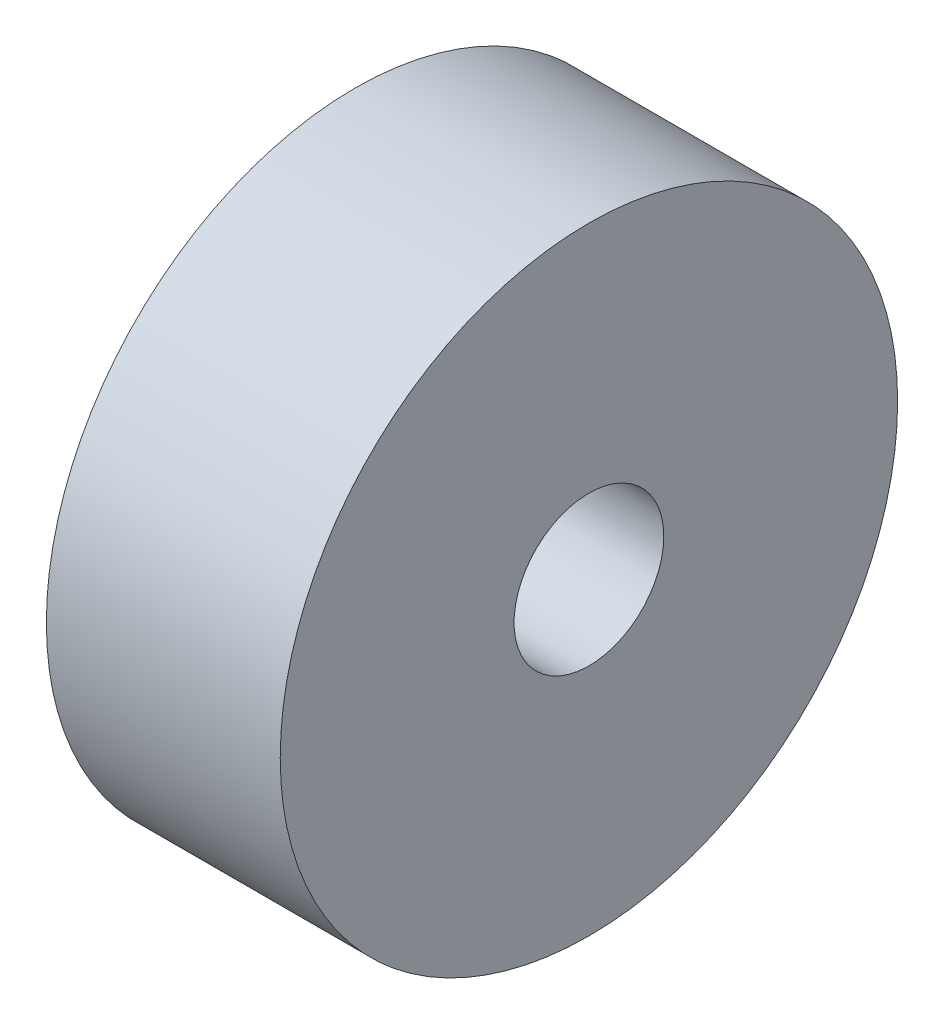
ISO-10303-21;
HEADER;
FILE_DESCRIPTION(('STEP AP214'),'2;1');
FILE_NAME('part.step','',(''),(''),'','','');
FILE_SCHEMA(('AUTOMOTIVE_DESIGN { 1 0 10303 214 1 1 1 1 }'));
ENDSEC;
DATA;
#1=APPLICATION_CONTEXT('core data for automotive mechanical design processes');
#2=APPLICATION_PROTOCOL_DEFINITION('international standard','automotive_design',2000,#1);
#3=PRODUCT_CONTEXT('',#1,'mechanical');
#4=PRODUCT('Part','Part','',(#3));
#5=PRODUCT_RELATED_PRODUCT_CATEGORY('part','',(#4));
#6=PRODUCT_DEFINITION_FORMATION('','',#4);
#7=PRODUCT_DEFINITION_CONTEXT('part definition',#1,'design');
#8=PRODUCT_DEFINITION('design','',#6,#7);
#9=PRODUCT_DEFINITION_SHAPE('','',#8);
#10=(LENGTH_UNIT() NAMED_UNIT(*) SI_UNIT(.MILLI.,.METRE.));
#11=(NAMED_UNIT(*) PLANE_ANGLE_UNIT() SI_UNIT($,.RADIAN.));
#12=(NAMED_UNIT(*) SI_UNIT($,.STERADIAN.) SOLID_ANGLE_UNIT());
#13=UNCERTAINTY_MEASURE_WITH_UNIT(LENGTH_MEASURE(1.E-05),#10,'distance_accuracy_value','');
#14=(GEOMETRIC_REPRESENTATION_CONTEXT(3) GLOBAL_UNCERTAINTY_ASSIGNED_CONTEXT((#13)) GLOBAL_UNIT_ASSIGNED_CONTEXT((#10,
#11,#12)) REPRESENTATION_CONTEXT('',''));
#15=CARTESIAN_POINT('',(0.,0.,0.));
#16=DIRECTION('',(0.,0.,1.));
#17=DIRECTION('',(1.,0.,0.));
#18=AXIS2_PLACEMENT_3D('',#15,#16,#17);
#19=CARTESIAN_POINT('',(25.,0.,0.));
#20=DIRECTION('',(-1.,0.,0.));
#21=DIRECTION('',(0.,0.,1.));
#22=AXIS2_PLACEMENT_3D('',#19,#20,#21);
#23=CYLINDRICAL_SURFACE('',#22,33.);
#24=CARTESIAN_POINT('',(25.,0.,0.));
#25=DIRECTION('',(1.,0.,0.));
#26=DIRECTION('',(0.,0.,-1.));
#27=AXIS2_PLACEMENT_3D('',#24,#25,#26);
#28=CIRCLE('',#27,33.);
#29=CARTESIAN_POINT('',(25.,0.,-33.));
#30=VERTEX_POINT('',#29);
#31=EDGE_CURVE('E10',#30,#30,#28,.T.);
#32=ORIENTED_EDGE('',*,*,#31,.F.);
#33=EDGE_LOOP('',(#32));
#34=FACE_BOUND('',#33,.T.);
#35=CARTESIAN_POINT('',(0.,0.,0.));
#36=DIRECTION('',(1.,0.,0.));
#37=DIRECTION('',(0.,0.,-1.));
#38=AXIS2_PLACEMENT_3D('',#35,#36,#37);
#39=CIRCLE('',#38,33.);
#40=CARTESIAN_POINT('',(0.,0.,-33.));
#41=VERTEX_POINT('',#40);
#42=EDGE_CURVE('E41',#41,#41,#39,.T.);
#43=ORIENTED_EDGE('',*,*,#42,.T.);
#44=EDGE_LOOP('',(#43));
#45=FACE_BOUND('',#44,.T.);
#46=ADVANCED_FACE('F34',(#34,#45),#23,.T.);
#47=CARTESIAN_POINT('',(25.,0.,0.));
#48=DIRECTION('',(1.,0.,0.));
#49=DIRECTION('',(0.,0.,-1.));
#50=AXIS2_PLACEMENT_3D('',#47,#48,#49);
#51=PLANE('',#50);
#52=CARTESIAN_POINT('',(25.,0.,0.));
#53=DIRECTION('',(1.,0.,0.));
#54=DIRECTION('',(0.,0.,-1.));
#55=AXIS2_PLACEMENT_3D('',#52,#53,#54);
#56=CIRCLE('',#55,8.);
#57=CARTESIAN_POINT('',(25.,0.,-8.));
#58=VERTEX_POINT('',#57);
#59=EDGE_CURVE('E47',#58,#58,#56,.T.);
#60=ORIENTED_EDGE('',*,*,#59,.F.);
#61=EDGE_LOOP('',(#60));
#62=FACE_BOUND('',#61,.T.);
#63=ORIENTED_EDGE('',*,*,#31,.T.);
#64=EDGE_LOOP('',(#63));
#65=FACE_BOUND('',#64,.T.);
#66=ADVANCED_FACE('F63',(#62,#65),#51,.T.);
#67=CARTESIAN_POINT('',(0.,0.,0.));
#68=DIRECTION('',(1.,0.,0.));
#69=DIRECTION('',(0.,0.,-1.));
#70=AXIS2_PLACEMENT_3D('',#67,#68,#69);
#71=PLANE('',#70);
#72=CARTESIAN_POINT('',(0.,0.,0.));
#73=DIRECTION('',(1.,0.,0.));
#74=DIRECTION('',(0.,0.,-1.));
#75=AXIS2_PLACEMENT_3D('',#72,#73,#74);
#76=CIRCLE('',#75,8.);
#77=CARTESIAN_POINT('',(0.,0.,-8.));
#78=VERTEX_POINT('',#77);
#79=EDGE_CURVE('E37',#78,#78,#76,.T.);
#80=ORIENTED_EDGE('',*,*,#79,.T.);
#81=EDGE_LOOP('',(#80));
#82=FACE_BOUND('',#81,.T.);
#83=ORIENTED_EDGE('',*,*,#42,.F.);
#84=EDGE_LOOP('',(#83));
#85=FACE_BOUND('',#84,.T.);
#86=ADVANCED_FACE('F54',(#82,#85),#71,.F.);
#87=CARTESIAN_POINT('',(-1.2E-05,0.,0.));
#88=DIRECTION('',(1.,0.,0.));
#89=DIRECTION('',(0.,0.,-1.));
#90=AXIS2_PLACEMENT_3D('',#87,#88,#89);
#91=CYLINDRICAL_SURFACE('',#90,8.);
#92=CARTESIAN_POINT('',(25.,0.,-8.));
#93=CARTESIAN_POINT('',(24.7395833333333,0.,-8.));
#94=CARTESIAN_POINT('',(24.4791666666667,0.,-8.));
#95=CARTESIAN_POINT('',(23.9583333333333,0.,-8.));
#96=CARTESIAN_POINT('',(23.6979166666667,0.,-8.));
#97=CARTESIAN_POINT('',(23.1770833333333,0.,-8.));
#98=CARTESIAN_POINT('',(22.9166666666667,0.,-8.));
#99=CARTESIAN_POINT('',(22.3958333333333,0.,-8.));
#100=CARTESIAN_POINT('',(22.1354166666667,0.,-8.));
#101=CARTESIAN_POINT('',(21.6145833333333,0.,-8.));
#102=CARTESIAN_POINT('',(21.3541666666667,0.,-8.));
#103=CARTESIAN_POINT('',(20.8333333333333,0.,-8.));
#104=CARTESIAN_POINT('',(20.5729166666667,0.,-8.));
#105=CARTESIAN_POINT('',(20.0520833333333,0.,-8.));
#106=CARTESIAN_POINT('',(19.7916666666667,0.,-8.));
#107=CARTESIAN_POINT('',(19.2708333333333,0.,-8.));
#108=CARTESIAN_POINT('',(19.0104166666667,0.,-8.));
#109=CARTESIAN_POINT('',(18.4895833333333,0.,-8.));
#110=CARTESIAN_POINT('',(18.2291666666667,0.,-8.));
#111=CARTESIAN_POINT('',(17.7083333333333,0.,-8.));
#112=CARTESIAN_POINT('',(17.4479166666667,0.,-8.));
#113=CARTESIAN_POINT('',(16.9270833333333,0.,-8.));
#114=CARTESIAN_POINT('',(16.6666666666667,0.,-8.));
#115=CARTESIAN_POINT('',(16.1458333333333,0.,-8.));
#116=CARTESIAN_POINT('',(15.8854166666667,0.,-8.));
#117=CARTESIAN_POINT('',(15.3645833333333,0.,-8.));
#118=CARTESIAN_POINT('',(15.1041666666667,0.,-8.));
#119=CARTESIAN_POINT('',(14.5833333333333,0.,-8.));
#120=CARTESIAN_POINT('',(14.3229166666667,0.,-8.));
#121=CARTESIAN_POINT('',(13.8020833333333,0.,-8.));
#122=CARTESIAN_POINT('',(13.5416666666667,0.,-8.));
#123=CARTESIAN_POINT('',(13.0208333333333,0.,-8.));
#124=CARTESIAN_POINT('',(12.7604166666667,0.,-8.));
#125=CARTESIAN_POINT('',(12.2395833333333,0.,-8.));
#126=CARTESIAN_POINT('',(11.9791666666667,0.,-8.));
#127=CARTESIAN_POINT('',(11.4583333333333,0.,-8.));
#128=CARTESIAN_POINT('',(11.1979166666667,0.,-8.));
#129=CARTESIAN_POINT('',(10.6770833333333,0.,-8.));
#130=CARTESIAN_POINT('',(10.4166666666667,0.,-8.));
#131=CARTESIAN_POINT('',(9.89583333333333,0.,-8.));
#132=CARTESIAN_POINT('',(9.63541666666667,0.,-8.));
#133=CARTESIAN_POINT('',(9.11458333333333,0.,-8.));
#134=CARTESIAN_POINT('',(8.85416666666667,0.,-8.));
#135=CARTESIAN_POINT('',(8.33333333333333,0.,-8.));
#136=CARTESIAN_POINT('',(8.07291666666667,0.,-8.));
#137=CARTESIAN_POINT('',(7.55208333333333,0.,-8.));
#138=CARTESIAN_POINT('',(7.29166666666667,0.,-8.));
#139=CARTESIAN_POINT('',(6.77083333333333,0.,-8.));
#140=CARTESIAN_POINT('',(6.51041666666667,0.,-8.));
#141=CARTESIAN_POINT('',(5.98958333333333,0.,-8.));
#142=CARTESIAN_POINT('',(5.72916666666667,0.,-8.));
#143=CARTESIAN_POINT('',(5.20833333333333,0.,-8.));
#144=CARTESIAN_POINT('',(4.94791666666667,0.,-8.));
#145=CARTESIAN_POINT('',(4.42708333333333,0.,-8.));
#146=CARTESIAN_POINT('',(4.16666666666667,0.,-8.));
#147=CARTESIAN_POINT('',(3.64583333333333,0.,-8.));
#148=CARTESIAN_POINT('',(3.38541666666667,0.,-8.));
#149=CARTESIAN_POINT('',(2.86458333333333,0.,-8.));
#150=CARTESIAN_POINT('',(2.60416666666667,0.,-8.));
#151=CARTESIAN_POINT('',(2.08333333333333,0.,-8.));
#152=CARTESIAN_POINT('',(1.82291666666667,0.,-8.));
#153=CARTESIAN_POINT('',(1.30208333333334,0.,-8.));
#154=CARTESIAN_POINT('',(1.04166666666667,0.,-8.));
#155=CARTESIAN_POINT('',(0.520833333333334,0.,-8.));
#156=CARTESIAN_POINT('',(0.260416666666668,0.,-8.));
#157=CARTESIAN_POINT('',(0.,0.,-8.));
#158=B_SPLINE_CURVE_WITH_KNOTS('',3,(#92,#93,#94,#95,#96,#97,#98,#99,#100,#101,#102,#103,#104,
#105,#106,#107,#108,#109,#110,#111,#112,#113,#114,#115,#116,#117,#118,#119,#120,#121,#122,#123,
#124,#125,#126,#127,#128,#129,#130,#131,#132,#133,#134,#135,#136,#137,#138,#139,#140,#141,#142,
#143,#144,#145,#146,#147,#148,#149,#150,#151,#152,#153,#154,#155,#156,#157),.UNSPECIFIED.,.F.,
.F.,(4,2,2,2,2,2,2,2,2,2,2,2,2,2,2,2,2,2,2,2,2,2,2,2,2,2,2,2,2,2,2,2,4),(0.,0.781250000000001,
1.5625,2.34375,3.125,3.90625,4.6875,5.46875,6.25,7.03125,7.8125,8.59375,9.375,10.15625,10.9375,
11.71875,12.5,13.28125,14.0625,14.84375,15.625,16.40625,17.1875,17.96875,18.75,19.53125,20.3125,
21.09375,21.875,22.65625,23.4375,24.21875,25.),.UNSPECIFIED.);
#159=EDGE_CURVE('BSEAM57',#58,#78,#158,.T.);
#160=ORIENTED_EDGE('',*,*,#59,.T.);
#161=ORIENTED_EDGE('',*,*,#79,.F.);
#162=ORIENTED_EDGE('',*,*,#159,.T.);
#163=ORIENTED_EDGE('',*,*,#159,.F.);
#164=EDGE_LOOP('',(#160,#162,#161,#163));
#165=FACE_BOUND('',#164,.T.);
#166=ADVANCED_FACE('F57',(#165),#91,.F.);
#167=CLOSED_SHELL('',(#46,#66,#86,#166));
#168=MANIFOLD_SOLID_BREP('B2',#167);
#169=ADVANCED_BREP_SHAPE_REPRESENTATION('',(#18,#168),#14);
#170=SHAPE_DEFINITION_REPRESENTATION(#9,#169);
ENDSEC;
END-ISO-10303-21;
